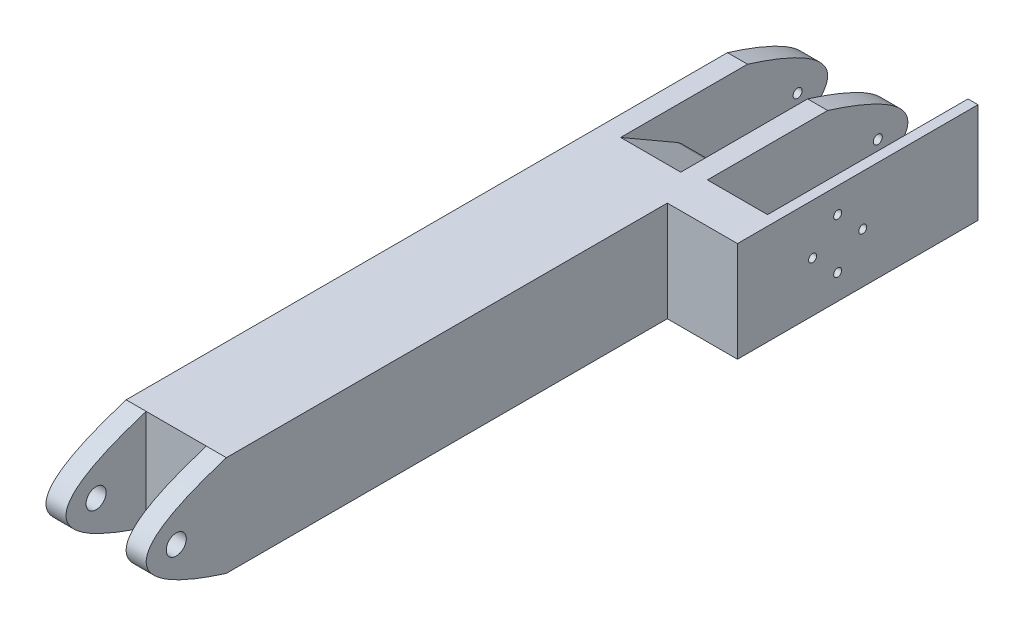
ISO-10303-21;
HEADER;
FILE_DESCRIPTION(('STEP AP214'),'2;1');
FILE_NAME('part.step','',(''),(''),'','','');
FILE_SCHEMA(('AUTOMOTIVE_DESIGN { 1 0 10303 214 1 1 1 1 }'));
ENDSEC;
DATA;
#1=APPLICATION_CONTEXT('core data for automotive mechanical design processes');
#2=APPLICATION_PROTOCOL_DEFINITION('international standard','automotive_design',2000,#1);
#3=PRODUCT_CONTEXT('',#1,'mechanical');
#4=PRODUCT('Part','Part','',(#3));
#5=PRODUCT_RELATED_PRODUCT_CATEGORY('part','',(#4));
#6=PRODUCT_DEFINITION_FORMATION('','',#4);
#7=PRODUCT_DEFINITION_CONTEXT('part definition',#1,'design');
#8=PRODUCT_DEFINITION('design','',#6,#7);
#9=PRODUCT_DEFINITION_SHAPE('','',#8);
#10=(LENGTH_UNIT() NAMED_UNIT(*) SI_UNIT(.MILLI.,.METRE.));
#11=(NAMED_UNIT(*) PLANE_ANGLE_UNIT() SI_UNIT($,.RADIAN.));
#12=(NAMED_UNIT(*) SI_UNIT($,.STERADIAN.) SOLID_ANGLE_UNIT());
#13=UNCERTAINTY_MEASURE_WITH_UNIT(LENGTH_MEASURE(1.E-05),#10,'distance_accuracy_value','');
#14=(GEOMETRIC_REPRESENTATION_CONTEXT(3) GLOBAL_UNCERTAINTY_ASSIGNED_CONTEXT((#13)) GLOBAL_UNIT_ASSIGNED_CONTEXT((#10,
#11,#12)) REPRESENTATION_CONTEXT('',''));
#15=CARTESIAN_POINT('',(0.,0.,0.));
#16=DIRECTION('',(0.,0.,1.));
#17=DIRECTION('',(1.,0.,0.));
#18=AXIS2_PLACEMENT_3D('',#15,#16,#17);
#19=CARTESIAN_POINT('',(50.,17.0460014070586,295.871498940101));
#20=DIRECTION('',(-1.,0.,0.));
#21=DIRECTION('',(0.,0.,1.));
#22=AXIS2_PLACEMENT_3D('',#19,#20,#21);
#23=PLANE('',#22);
#24=CARTESIAN_POINT('',(50.,17.0460014069818,-69.1285010598985));
#25=DIRECTION('',(1.,0.,0.));
#26=DIRECTION('',(0.,0.,-1.));
#27=AXIS2_PLACEMENT_3D('',#24,#25,#26);
#28=CIRCLE('',#27,2.25);
#29=CARTESIAN_POINT('',(50.,17.0460014069818,-71.3785010598985));
#30=VERTEX_POINT('',#29);
#31=EDGE_CURVE('E283',#30,#30,#28,.T.);
#32=ORIENTED_EDGE('',*,*,#31,.F.);
#33=EDGE_LOOP('',(#32));
#34=FACE_BOUND('',#33,.T.);
#35=DIRECTION('',(0.,1.,0.));
#36=VECTOR('',#35,1.);
#37=CARTESIAN_POINT('',(50.,-7.95399859301822,15.8714989401015));
#38=LINE('',#37,#36);
#39=CARTESIAN_POINT('',(50.,-7.95399859301822,15.8714989401015));
#40=VERTEX_POINT('',#39);
#41=CARTESIAN_POINT('',(50.,42.0460014069818,15.8714989401015));
#42=VERTEX_POINT('',#41);
#43=EDGE_CURVE('E460',#40,#42,#38,.T.);
#44=ORIENTED_EDGE('',*,*,#43,.F.);
#45=DIRECTION('',(0.,0.,-1.));
#46=VECTOR('',#45,1.);
#47=CARTESIAN_POINT('',(50.,-7.95399859301822,255.871498940101));
#48=LINE('',#47,#46);
#49=CARTESIAN_POINT('',(50.,-7.95399859301822,-44.1285010598985));
#50=VERTEX_POINT('',#49);
#51=EDGE_CURVE('E198',#40,#50,#48,.T.);
#52=ORIENTED_EDGE('',*,*,#51,.T.);
#53=CARTESIAN_POINT('',(50.,-7.95399859301822,-44.1285010598985));
#54=CARTESIAN_POINT('',(50.,17.0460014069818,-124.128501059899));
#55=CARTESIAN_POINT('',(50.,42.0460014069818,-44.1285010598985));
#56=B_SPLINE_CURVE_WITH_KNOTS('',2,(#53,#54,#55),.UNSPECIFIED.,.F.,.F.,(3,3),(0.,1.),.UNSPECIFIED.);
#57=CARTESIAN_POINT('',(50.,42.0460014069818,-44.1285010598985));
#58=VERTEX_POINT('',#57);
#59=EDGE_CURVE('E197',#50,#58,#56,.T.);
#60=ORIENTED_EDGE('',*,*,#59,.T.);
#61=DIRECTION('',(0.,0.,1.));
#62=VECTOR('',#61,1.);
#63=CARTESIAN_POINT('',(50.,42.0460014069818,255.871498940101));
#64=LINE('',#63,#62);
#65=EDGE_CURVE('E213',#58,#42,#64,.T.);
#66=ORIENTED_EDGE('',*,*,#65,.T.);
#67=EDGE_LOOP('',(#44,#52,#60,#66));
#68=FACE_BOUND('',#67,.T.);
#69=ADVANCED_FACE('F39',(#34,#68),#23,.F.);
#70=CARTESIAN_POINT('',(50.,42.0460014069818,255.871498940101));
#71=DIRECTION('',(0.,-1.,0.));
#72=DIRECTION('',(0.,0.,-1.));
#73=AXIS2_PLACEMENT_3D('',#70,#71,#72);
#74=PLANE('',#73);
#75=DIRECTION('',(0.,0.,1.));
#76=VECTOR('',#75,1.);
#77=CARTESIAN_POINT('',(40.,42.0460014069818,255.871498940101));
#78=LINE('',#77,#76);
#79=CARTESIAN_POINT('',(40.,42.0460014069818,-44.1285010598986));
#80=VERTEX_POINT('',#79);
#81=CARTESIAN_POINT('',(40.,42.0460014069818,19.1727691293236));
#82=VERTEX_POINT('',#81);
#83=EDGE_CURVE('E352',#80,#82,#78,.T.);
#84=ORIENTED_EDGE('',*,*,#83,.T.);
#85=DIRECTION('',(-1.,0.,0.));
#86=VECTOR('',#85,1.);
#87=CARTESIAN_POINT('',(40.,42.0460014069818,19.1727691293236));
#88=LINE('',#87,#86);
#89=CARTESIAN_POINT('',(10.,42.0460014069818,19.1727691293236));
#90=VERTEX_POINT('',#89);
#91=EDGE_CURVE('E399',#82,#90,#88,.T.);
#92=ORIENTED_EDGE('',*,*,#91,.T.);
#93=DIRECTION('',(0.,0.,-1.));
#94=VECTOR('',#93,1.);
#95=CARTESIAN_POINT('',(10.,42.0460014069818,255.871498940101));
#96=LINE('',#95,#94);
#97=CARTESIAN_POINT('',(10.,42.0460014069818,-44.1285010598986));
#98=VERTEX_POINT('',#97);
#99=EDGE_CURVE('E358',#90,#98,#96,.T.);
#100=ORIENTED_EDGE('',*,*,#99,.T.);
#101=DIRECTION('',(-1.,0.,0.));
#102=VECTOR('',#101,1.);
#103=CARTESIAN_POINT('',(50.,42.0460014069818,-44.1285010598985));
#104=LINE('',#103,#102);
#105=CARTESIAN_POINT('',(0.,42.0460014069818,-44.1285010598985));
#106=VERTEX_POINT('',#105);
#107=EDGE_CURVE('E333',#98,#106,#104,.T.);
#108=ORIENTED_EDGE('',*,*,#107,.T.);
#109=DIRECTION('',(0.,0.,1.));
#110=VECTOR('',#109,1.);
#111=CARTESIAN_POINT('',(0.,42.0460014069818,255.871498940101));
#112=LINE('',#111,#110);
#113=CARTESIAN_POINT('',(0.,42.0460014069818,255.871498940101));
#114=VERTEX_POINT('',#113);
#115=EDGE_CURVE('E323',#106,#114,#112,.T.);
#116=ORIENTED_EDGE('',*,*,#115,.T.);
#117=DIRECTION('',(-1.,0.,0.));
#118=VECTOR('',#117,1.);
#119=CARTESIAN_POINT('',(50.,42.0460014069818,255.871498940101));
#120=LINE('',#119,#118);
#121=CARTESIAN_POINT('',(10.,42.0460014069818,255.871498940101));
#122=VERTEX_POINT('',#121);
#123=EDGE_CURVE('E335',#122,#114,#120,.T.);
#124=ORIENTED_EDGE('',*,*,#123,.F.);
#125=CARTESIAN_POINT('',(40.,42.0460014069818,255.871498940101));
#126=VERTEX_POINT('',#125);
#127=EDGE_CURVE('E334',#126,#122,#120,.T.);
#128=ORIENTED_EDGE('',*,*,#127,.F.);
#129=CARTESIAN_POINT('',(50.,42.0460014069818,255.871498940101));
#130=VERTEX_POINT('',#129);
#131=EDGE_CURVE('E330',#130,#126,#120,.T.);
#132=ORIENTED_EDGE('',*,*,#131,.F.);
#133=CARTESIAN_POINT('',(50.,42.0460014069818,35.8714989401015));
#134=VERTEX_POINT('',#133);
#135=EDGE_CURVE('E202',#134,#130,#64,.T.);
#136=ORIENTED_EDGE('',*,*,#135,.F.);
#137=DIRECTION('',(1.,0.,0.));
#138=VECTOR('',#137,1.);
#139=CARTESIAN_POINT('',(50.,42.0460014069818,35.8714989401015));
#140=LINE('',#139,#138);
#141=CARTESIAN_POINT('',(85.,42.0460014069818,35.8714989401015));
#142=VERTEX_POINT('',#141);
#143=EDGE_CURVE('E170',#134,#142,#140,.T.);
#144=ORIENTED_EDGE('',*,*,#143,.T.);
#145=DIRECTION('',(0.,0.,-1.));
#146=VECTOR('',#145,1.);
#147=CARTESIAN_POINT('',(85.,42.0460014069818,35.8714989401015));
#148=LINE('',#147,#146);
#149=CARTESIAN_POINT('',(85.,42.0460014069818,-84.1285010598986));
#150=VERTEX_POINT('',#149);
#151=EDGE_CURVE('E756',#142,#150,#148,.T.);
#152=ORIENTED_EDGE('',*,*,#151,.T.);
#153=DIRECTION('',(-1.,0.,0.));
#154=VECTOR('',#153,1.);
#155=CARTESIAN_POINT('',(85.,42.0460014069818,-84.1285010598986));
#156=LINE('',#155,#154);
#157=CARTESIAN_POINT('',(80.,42.0460014069818,-84.1285010598986));
#158=VERTEX_POINT('',#157);
#159=EDGE_CURVE('E761',#150,#158,#156,.T.);
#160=ORIENTED_EDGE('',*,*,#159,.T.);
#161=DIRECTION('',(0.,0.,1.));
#162=VECTOR('',#161,1.);
#163=CARTESIAN_POINT('',(80.,42.0460014069818,-84.1285010598986));
#164=LINE('',#163,#162);
#165=CARTESIAN_POINT('',(80.,42.0460014069818,15.8714989401015));
#166=VERTEX_POINT('',#165);
#167=EDGE_CURVE('E774',#158,#166,#164,.T.);
#168=ORIENTED_EDGE('',*,*,#167,.T.);
#169=DIRECTION('',(-1.,0.,0.));
#170=VECTOR('',#169,1.);
#171=CARTESIAN_POINT('',(80.,42.0460014069818,15.8714989401015));
#172=LINE('',#171,#170);
#173=EDGE_CURVE('E189',#166,#42,#172,.T.);
#174=ORIENTED_EDGE('',*,*,#173,.T.);
#175=ORIENTED_EDGE('',*,*,#65,.F.);
#176=EDGE_CURVE('E336',#58,#80,#104,.T.);
#177=ORIENTED_EDGE('',*,*,#176,.T.);
#178=EDGE_LOOP('',(#84,#92,#100,#108,#116,#124,#128,#132,#136,#144,#152,#160,#168,#174,#175,#177));
#179=FACE_BOUND('',#178,.T.);
#180=ADVANCED_FACE('F226',(#179),#74,.F.);
#181=CARTESIAN_POINT('',(50.,42.0460014069818,255.871498940101));
#182=CARTESIAN_POINT('',(50.,17.0460014071354,335.871498940102));
#183=CARTESIAN_POINT('',(50.,-7.95399859301822,255.871498940101));
#184=B_SPLINE_CURVE_WITH_KNOTS('',2,(#181,#182,#183),.UNSPECIFIED.,.F.,.F.,(3,3),(0.,1.),.UNSPECIFIED.);
#185=DIRECTION('',(-1.,0.,0.));
#186=VECTOR('',#185,1.);
#187=SURFACE_OF_LINEAR_EXTRUSION('',#184,#186);
#188=DIRECTION('',(-1.,0.,0.));
#189=VECTOR('',#188,1.);
#190=CARTESIAN_POINT('',(50.,-7.95399859301822,255.871498940101));
#191=LINE('',#190,#189);
#192=CARTESIAN_POINT('',(10.,-7.95399859301822,255.871498940101));
#193=VERTEX_POINT('',#192);
#194=CARTESIAN_POINT('',(0.,-7.95399859301822,255.871498940101));
#195=VERTEX_POINT('',#194);
#196=EDGE_CURVE('E345',#193,#195,#191,.T.);
#197=ORIENTED_EDGE('',*,*,#196,.F.);
#198=CARTESIAN_POINT('',(10.,42.0460014069818,255.871498940101));
#199=CARTESIAN_POINT('',(10.,17.0460014071354,335.871498940102));
#200=CARTESIAN_POINT('',(10.,-7.95399859301822,255.871498940101));
#201=B_SPLINE_CURVE_WITH_KNOTS('',2,(#198,#199,#200),.UNSPECIFIED.,.F.,.F.,(3,3),(0.,1.),.UNSPECIFIED.);
#202=EDGE_CURVE('E353',#193,#122,#201,.F.);
#203=ORIENTED_EDGE('',*,*,#202,.T.);
#204=ORIENTED_EDGE('',*,*,#123,.T.);
#205=CARTESIAN_POINT('',(0.,42.0460014069818,255.871498940101));
#206=CARTESIAN_POINT('',(0.,17.0460014071354,335.871498940102));
#207=CARTESIAN_POINT('',(0.,-7.95399859301822,255.871498940101));
#208=B_SPLINE_CURVE_WITH_KNOTS('',2,(#205,#206,#207),.UNSPECIFIED.,.F.,.F.,(3,3),(0.,1.),.UNSPECIFIED.);
#209=EDGE_CURVE('E300',#114,#195,#208,.T.);
#210=ORIENTED_EDGE('',*,*,#209,.T.);
#211=EDGE_LOOP('',(#197,#203,#204,#210));
#212=FACE_BOUND('',#211,.T.);
#213=ADVANCED_FACE('F233',(#212),#187,.F.);
#214=CARTESIAN_POINT('',(50.,17.0460014070886,280.871498940101));
#215=DIRECTION('',(-1.,0.,0.));
#216=DIRECTION('',(0.,0.,1.));
#217=AXIS2_PLACEMENT_3D('',#214,#215,#216);
#218=CYLINDRICAL_SURFACE('',#217,4.99999999999999);
#219=CARTESIAN_POINT('',(10.,17.0460014070886,280.871498940101));
#220=DIRECTION('',(-1.,0.,0.));
#221=DIRECTION('',(0.,0.,1.));
#222=AXIS2_PLACEMENT_3D('',#219,#220,#221);
#223=CIRCLE('',#222,4.99999999999999);
#224=CARTESIAN_POINT('',(10.,17.0460014070886,285.871498940101));
#225=VERTEX_POINT('',#224);
#226=EDGE_CURVE('E366',#225,#225,#223,.T.);
#227=ORIENTED_EDGE('',*,*,#226,.F.);
#228=EDGE_LOOP('',(#227));
#229=FACE_BOUND('',#228,.T.);
#230=CARTESIAN_POINT('',(0.,17.0460014070886,280.871498940101));
#231=DIRECTION('',(1.,0.,0.));
#232=DIRECTION('',(0.,0.,-1.));
#233=AXIS2_PLACEMENT_3D('',#230,#231,#232);
#234=CIRCLE('',#233,4.99999999999999);
#235=CARTESIAN_POINT('',(0.,17.0460014070886,275.871498940101));
#236=VERTEX_POINT('',#235);
#237=EDGE_CURVE('E285',#236,#236,#234,.T.);
#238=ORIENTED_EDGE('',*,*,#237,.F.);
#239=EDGE_LOOP('',(#238));
#240=FACE_BOUND('',#239,.T.);
#241=ADVANCED_FACE('F240',(#229,#240),#218,.F.);
#242=DIRECTION('',(-1.,0.,0.));
#243=VECTOR('',#242,1.);
#244=SURFACE_OF_LINEAR_EXTRUSION('',#56,#243);
#245=ORIENTED_EDGE('',*,*,#107,.F.);
#246=CARTESIAN_POINT('',(10.,-7.95399859301822,-44.1285010598985));
#247=CARTESIAN_POINT('',(10.,17.0460014069818,-124.128501059899));
#248=CARTESIAN_POINT('',(10.,42.0460014069818,-44.1285010598985));
#249=B_SPLINE_CURVE_WITH_KNOTS('',2,(#246,#247,#248),.UNSPECIFIED.,.F.,.F.,(3,3),(0.,1.),.UNSPECIFIED.);
#250=CARTESIAN_POINT('',(10.,-7.95399859301822,-44.1285010598985));
#251=VERTEX_POINT('',#250);
#252=EDGE_CURVE('E440',#98,#251,#249,.F.);
#253=ORIENTED_EDGE('',*,*,#252,.T.);
#254=DIRECTION('',(-1.,0.,0.));
#255=VECTOR('',#254,1.);
#256=CARTESIAN_POINT('',(50.,-7.95399859301822,-44.1285010598985));
#257=LINE('',#256,#255);
#258=CARTESIAN_POINT('',(0.,-7.95399859301822,-44.1285010598985));
#259=VERTEX_POINT('',#258);
#260=EDGE_CURVE('E340',#251,#259,#257,.T.);
#261=ORIENTED_EDGE('',*,*,#260,.T.);
#262=CARTESIAN_POINT('',(0.,-7.95399859301822,-44.1285010598985));
#263=CARTESIAN_POINT('',(0.,17.0460014069818,-124.128501059899));
#264=CARTESIAN_POINT('',(0.,42.0460014069818,-44.1285010598985));
#265=B_SPLINE_CURVE_WITH_KNOTS('',2,(#262,#263,#264),.UNSPECIFIED.,.F.,.F.,(3,3),(0.,1.),.UNSPECIFIED.);
#266=EDGE_CURVE('E310',#259,#106,#265,.T.);
#267=ORIENTED_EDGE('',*,*,#266,.T.);
#268=EDGE_LOOP('',(#245,#253,#261,#267));
#269=FACE_BOUND('',#268,.T.);
#270=ADVANCED_FACE('F225',(#269),#244,.F.);
#271=CARTESIAN_POINT('',(50.,17.0460014069818,-69.1285010598985));
#272=DIRECTION('',(-1.,0.,0.));
#273=DIRECTION('',(0.,0.,1.));
#274=AXIS2_PLACEMENT_3D('',#271,#272,#273);
#275=CYLINDRICAL_SURFACE('',#274,2.25);
#276=CARTESIAN_POINT('',(10.,17.0460014069818,-69.1285010598985));
#277=DIRECTION('',(-1.,0.,0.));
#278=DIRECTION('',(0.,0.,1.));
#279=AXIS2_PLACEMENT_3D('',#276,#277,#278);
#280=CIRCLE('',#279,2.25);
#281=CARTESIAN_POINT('',(10.,17.0460014069818,-66.8785010598985));
#282=VERTEX_POINT('',#281);
#283=EDGE_CURVE('E354',#282,#282,#280,.T.);
#284=ORIENTED_EDGE('',*,*,#283,.F.);
#285=EDGE_LOOP('',(#284));
#286=FACE_BOUND('',#285,.T.);
#287=CARTESIAN_POINT('',(0.,17.0460014069818,-69.1285010598985));
#288=DIRECTION('',(1.,0.,0.));
#289=DIRECTION('',(0.,0.,-1.));
#290=AXIS2_PLACEMENT_3D('',#287,#288,#289);
#291=CIRCLE('',#290,2.25);
#292=CARTESIAN_POINT('',(0.,17.0460014069818,-71.3785010598985));
#293=VERTEX_POINT('',#292);
#294=EDGE_CURVE('E286',#293,#293,#291,.T.);
#295=ORIENTED_EDGE('',*,*,#294,.F.);
#296=EDGE_LOOP('',(#295));
#297=FACE_BOUND('',#296,.T.);
#298=ADVANCED_FACE('F253',(#286,#297),#275,.F.);
#299=CARTESIAN_POINT('',(50.,-7.95399859301822,255.871498940101));
#300=VERTEX_POINT('',#299);
#301=CARTESIAN_POINT('',(50.,-7.95399859301822,35.8714989401015));
#302=VERTEX_POINT('',#301);
#303=EDGE_CURVE('E183',#300,#302,#48,.T.);
#304=ORIENTED_EDGE('',*,*,#303,.T.);
#305=DIRECTION('',(0.,1.,0.));
#306=VECTOR('',#305,1.);
#307=CARTESIAN_POINT('',(50.,-7.95399859301822,35.8714989401015));
#308=LINE('',#307,#306);
#309=EDGE_CURVE('E165',#302,#134,#308,.T.);
#310=ORIENTED_EDGE('',*,*,#309,.T.);
#311=ORIENTED_EDGE('',*,*,#135,.T.);
#312=EDGE_CURVE('E194',#130,#300,#184,.T.);
#313=ORIENTED_EDGE('',*,*,#312,.T.);
#314=EDGE_LOOP('',(#304,#310,#311,#313));
#315=FACE_BOUND('',#314,.T.);
#316=CARTESIAN_POINT('',(50.,17.0460014070886,280.871498940101));
#317=DIRECTION('',(1.,0.,0.));
#318=DIRECTION('',(0.,0.,-1.));
#319=AXIS2_PLACEMENT_3D('',#316,#317,#318);
#320=CIRCLE('',#319,4.99999999999999);
#321=CARTESIAN_POINT('',(50.,17.0460014070886,275.871498940101));
#322=VERTEX_POINT('',#321);
#323=EDGE_CURVE('E291',#322,#322,#320,.T.);
#324=ORIENTED_EDGE('',*,*,#323,.F.);
#325=EDGE_LOOP('',(#324));
#326=FACE_BOUND('',#325,.T.);
#327=ADVANCED_FACE('F191',(#315,#326),#23,.F.);
#328=CARTESIAN_POINT('',(0.,17.0460014070586,295.871498940101));
#329=DIRECTION('',(-1.,0.,0.));
#330=DIRECTION('',(0.,0.,1.));
#331=AXIS2_PLACEMENT_3D('',#328,#329,#330);
#332=PLANE('',#331);
#333=ORIENTED_EDGE('',*,*,#237,.T.);
#334=EDGE_LOOP('',(#333));
#335=FACE_BOUND('',#334,.T.);
#336=ORIENTED_EDGE('',*,*,#209,.F.);
#337=ORIENTED_EDGE('',*,*,#115,.F.);
#338=ORIENTED_EDGE('',*,*,#266,.F.);
#339=DIRECTION('',(0.,0.,-1.));
#340=VECTOR('',#339,1.);
#341=CARTESIAN_POINT('',(0.,-7.95399859301822,255.871498940101));
#342=LINE('',#341,#340);
#343=EDGE_CURVE('E305',#195,#259,#342,.T.);
#344=ORIENTED_EDGE('',*,*,#343,.F.);
#345=EDGE_LOOP('',(#336,#337,#338,#344));
#346=FACE_BOUND('',#345,.T.);
#347=ORIENTED_EDGE('',*,*,#294,.T.);
#348=EDGE_LOOP('',(#347));
#349=FACE_BOUND('',#348,.T.);
#350=ADVANCED_FACE('F231',(#335,#346,#349),#332,.T.);
#351=ORIENTED_EDGE('',*,*,#131,.T.);
#352=CARTESIAN_POINT('',(40.,42.0460014069818,255.871498940101));
#353=CARTESIAN_POINT('',(40.,17.0460014071354,335.871498940102));
#354=CARTESIAN_POINT('',(40.,-7.95399859301822,255.871498940101));
#355=B_SPLINE_CURVE_WITH_KNOTS('',2,(#352,#353,#354),.UNSPECIFIED.,.F.,.F.,(3,3),(0.,1.),.UNSPECIFIED.);
#356=CARTESIAN_POINT('',(40.,-7.95399859301822,255.871498940101));
#357=VERTEX_POINT('',#356);
#358=EDGE_CURVE('E364',#126,#357,#355,.T.);
#359=ORIENTED_EDGE('',*,*,#358,.T.);
#360=EDGE_CURVE('E346',#300,#357,#191,.T.);
#361=ORIENTED_EDGE('',*,*,#360,.F.);
#362=ORIENTED_EDGE('',*,*,#312,.F.);
#363=EDGE_LOOP('',(#351,#359,#361,#362));
#364=FACE_BOUND('',#363,.T.);
#365=ADVANCED_FACE('F229',(#364),#187,.F.);
#366=CARTESIAN_POINT('',(50.,-7.95399859301822,255.871498940101));
#367=DIRECTION('',(0.,1.,0.));
#368=DIRECTION('',(0.,0.,1.));
#369=AXIS2_PLACEMENT_3D('',#366,#367,#368);
#370=PLANE('',#369);
#371=DIRECTION('',(-1.,0.,0.));
#372=VECTOR('',#371,1.);
#373=CARTESIAN_POINT('',(40.,-7.95399859301822,19.1727691293229));
#374=LINE('',#373,#372);
#375=CARTESIAN_POINT('',(40.,-7.95399859301822,19.1727691293229));
#376=VERTEX_POINT('',#375);
#377=CARTESIAN_POINT('',(10.,-7.95399859301822,19.1727691293229));
#378=VERTEX_POINT('',#377);
#379=EDGE_CURVE('E452',#376,#378,#374,.T.);
#380=ORIENTED_EDGE('',*,*,#379,.F.);
#381=DIRECTION('',(0.,0.,-1.));
#382=VECTOR('',#381,1.);
#383=CARTESIAN_POINT('',(40.,-7.95399859301822,255.871498940101));
#384=LINE('',#383,#382);
#385=CARTESIAN_POINT('',(40.,-7.95399859301822,-44.1285010598985));
#386=VERTEX_POINT('',#385);
#387=EDGE_CURVE('E359',#376,#386,#384,.T.);
#388=ORIENTED_EDGE('',*,*,#387,.T.);
#389=EDGE_CURVE('E341',#50,#386,#257,.T.);
#390=ORIENTED_EDGE('',*,*,#389,.F.);
#391=ORIENTED_EDGE('',*,*,#51,.F.);
#392=DIRECTION('',(-1.,0.,0.));
#393=VECTOR('',#392,1.);
#394=CARTESIAN_POINT('',(80.,-7.95399859301822,15.8714989401015));
#395=LINE('',#394,#393);
#396=CARTESIAN_POINT('',(80.,-7.95399859301822,15.8714989401015));
#397=VERTEX_POINT('',#396);
#398=EDGE_CURVE('E176',#397,#40,#395,.T.);
#399=ORIENTED_EDGE('',*,*,#398,.F.);
#400=DIRECTION('',(0.,0.,1.));
#401=VECTOR('',#400,1.);
#402=CARTESIAN_POINT('',(80.,-7.95399859301822,-84.1285010598986));
#403=LINE('',#402,#401);
#404=CARTESIAN_POINT('',(80.,-7.95399859301822,-84.1285010598986));
#405=VERTEX_POINT('',#404);
#406=EDGE_CURVE('E791',#405,#397,#403,.T.);
#407=ORIENTED_EDGE('',*,*,#406,.F.);
#408=DIRECTION('',(-1.,0.,0.));
#409=VECTOR('',#408,1.);
#410=CARTESIAN_POINT('',(85.,-7.95399859301822,-84.1285010598986));
#411=LINE('',#410,#409);
#412=CARTESIAN_POINT('',(85.,-7.95399859301822,-84.1285010598986));
#413=VERTEX_POINT('',#412);
#414=EDGE_CURVE('E794',#413,#405,#411,.T.);
#415=ORIENTED_EDGE('',*,*,#414,.F.);
#416=DIRECTION('',(0.,0.,-1.));
#417=VECTOR('',#416,1.);
#418=CARTESIAN_POINT('',(85.,-7.95399859301822,35.8714989401015));
#419=LINE('',#418,#417);
#420=CARTESIAN_POINT('',(85.,-7.95399859301822,35.8714989401015));
#421=VERTEX_POINT('',#420);
#422=EDGE_CURVE('E187',#421,#413,#419,.T.);
#423=ORIENTED_EDGE('',*,*,#422,.F.);
#424=DIRECTION('',(1.,0.,0.));
#425=VECTOR('',#424,1.);
#426=CARTESIAN_POINT('',(50.,-7.95399859301822,35.8714989401015));
#427=LINE('',#426,#425);
#428=EDGE_CURVE('E168',#302,#421,#427,.T.);
#429=ORIENTED_EDGE('',*,*,#428,.F.);
#430=ORIENTED_EDGE('',*,*,#303,.F.);
#431=ORIENTED_EDGE('',*,*,#360,.T.);
#432=DIRECTION('',(1.,0.,0.));
#433=VECTOR('',#432,1.);
#434=CARTESIAN_POINT('',(10.,-7.95399859301822,255.871498940101));
#435=LINE('',#434,#433);
#436=EDGE_CURVE('E393',#193,#357,#435,.T.);
#437=ORIENTED_EDGE('',*,*,#436,.F.);
#438=ORIENTED_EDGE('',*,*,#196,.T.);
#439=ORIENTED_EDGE('',*,*,#343,.T.);
#440=ORIENTED_EDGE('',*,*,#260,.F.);
#441=DIRECTION('',(0.,0.,1.));
#442=VECTOR('',#441,1.);
#443=CARTESIAN_POINT('',(10.,-7.95399859301822,255.871498940101));
#444=LINE('',#443,#442);
#445=EDGE_CURVE('E293',#251,#378,#444,.T.);
#446=ORIENTED_EDGE('',*,*,#445,.T.);
#447=EDGE_LOOP('',(#380,#388,#390,#391,#399,#407,#415,#423,#429,#430,#431,#437,#438,#439,#440,#446));
#448=FACE_BOUND('',#447,.T.);
#449=ADVANCED_FACE('F181',(#448),#370,.F.);
#450=ORIENTED_EDGE('',*,*,#389,.T.);
#451=CARTESIAN_POINT('',(40.,-7.95399859301822,-44.1285010598985));
#452=CARTESIAN_POINT('',(40.,17.0460014069818,-124.128501059899));
#453=CARTESIAN_POINT('',(40.,42.0460014069818,-44.1285010598985));
#454=B_SPLINE_CURVE_WITH_KNOTS('',2,(#451,#452,#453),.UNSPECIFIED.,.F.,.F.,(3,3),(0.,1.),.UNSPECIFIED.);
#455=EDGE_CURVE('E427',#386,#80,#454,.T.);
#456=ORIENTED_EDGE('',*,*,#455,.T.);
#457=ORIENTED_EDGE('',*,*,#176,.F.);
#458=ORIENTED_EDGE('',*,*,#59,.F.);
#459=EDGE_LOOP('',(#450,#456,#457,#458));
#460=FACE_BOUND('',#459,.T.);
#461=ADVANCED_FACE('F219',(#460),#244,.F.);
#462=CARTESIAN_POINT('',(40.,17.0460014070886,280.871498940101));
#463=DIRECTION('',(1.,0.,0.));
#464=DIRECTION('',(0.,0.,-1.));
#465=AXIS2_PLACEMENT_3D('',#462,#463,#464);
#466=CIRCLE('',#465,4.99999999999999);
#467=CARTESIAN_POINT('',(40.,17.0460014070886,275.871498940101));
#468=VERTEX_POINT('',#467);
#469=EDGE_CURVE('E360',#468,#468,#466,.T.);
#470=ORIENTED_EDGE('',*,*,#469,.F.);
#471=EDGE_LOOP('',(#470));
#472=FACE_BOUND('',#471,.T.);
#473=ORIENTED_EDGE('',*,*,#323,.T.);
#474=EDGE_LOOP('',(#473));
#475=FACE_BOUND('',#474,.T.);
#476=ADVANCED_FACE('F223',(#472,#475),#218,.F.);
#477=CARTESIAN_POINT('',(40.,17.0460014069818,-69.1285010598985));
#478=DIRECTION('',(1.,0.,0.));
#479=DIRECTION('',(0.,0.,-1.));
#480=AXIS2_PLACEMENT_3D('',#477,#478,#479);
#481=CIRCLE('',#480,2.25);
#482=CARTESIAN_POINT('',(40.,17.0460014069818,-71.3785010598985));
#483=VERTEX_POINT('',#482);
#484=EDGE_CURVE('E281',#483,#483,#481,.T.);
#485=ORIENTED_EDGE('',*,*,#484,.F.);
#486=EDGE_LOOP('',(#485));
#487=FACE_BOUND('',#486,.T.);
#488=ORIENTED_EDGE('',*,*,#31,.T.);
#489=EDGE_LOOP('',(#488));
#490=FACE_BOUND('',#489,.T.);
#491=ADVANCED_FACE('F259',(#487,#490),#275,.F.);
#492=CARTESIAN_POINT('',(10.,-35.,-84.1285010598986));
#493=DIRECTION('',(-1.,0.,0.));
#494=DIRECTION('',(0.,0.,1.));
#495=AXIS2_PLACEMENT_3D('',#492,#493,#494);
#496=PLANE('',#495);
#497=ORIENTED_EDGE('',*,*,#283,.T.);
#498=EDGE_LOOP('',(#497));
#499=FACE_BOUND('',#498,.T.);
#500=ORIENTED_EDGE('',*,*,#252,.F.);
#501=ORIENTED_EDGE('',*,*,#99,.F.);
#502=DIRECTION('',(0.,0.499999999999998,0.86602540378444));
#503=VECTOR('',#502,1.);
#504=CARTESIAN_POINT('',(10.,17.0460014069818,-24.1285010598986));
#505=LINE('',#504,#503);
#506=CARTESIAN_POINT('',(10.,25.7062554448261,-9.12850105989858));
#507=VERTEX_POINT('',#506);
#508=EDGE_CURVE('E457',#507,#90,#505,.T.);
#509=ORIENTED_EDGE('',*,*,#508,.F.);
#510=CARTESIAN_POINT('',(10.,17.0460014069817,-4.1285010598986));
#511=DIRECTION('',(-1.,0.,0.));
#512=DIRECTION('',(0.,0.,1.));
#513=AXIS2_PLACEMENT_3D('',#510,#511,#512);
#514=CIRCLE('',#513,10.);
#515=CARTESIAN_POINT('',(10.,8.38574736913734,-9.12850105989864));
#516=VERTEX_POINT('',#515);
#517=EDGE_CURVE('E48',#507,#516,#514,.T.);
#518=ORIENTED_EDGE('',*,*,#517,.T.);
#519=DIRECTION('',(0.,0.500000000000004,-0.866025403784436));
#520=VECTOR('',#519,1.);
#521=CARTESIAN_POINT('',(10.,17.0460014069818,-24.1285010598986));
#522=LINE('',#521,#520);
#523=EDGE_CURVE('E454',#378,#516,#522,.T.);
#524=ORIENTED_EDGE('',*,*,#523,.F.);
#525=ORIENTED_EDGE('',*,*,#445,.F.);
#526=EDGE_LOOP('',(#500,#501,#509,#518,#524,#525));
#527=FACE_BOUND('',#526,.T.);
#528=ADVANCED_FACE('F268',(#499,#527),#496,.F.);
#529=CARTESIAN_POINT('',(40.,-35.,-84.1285010598986));
#530=DIRECTION('',(1.,0.,0.));
#531=DIRECTION('',(0.,0.,-1.));
#532=AXIS2_PLACEMENT_3D('',#529,#530,#531);
#533=PLANE('',#532);
#534=ORIENTED_EDGE('',*,*,#484,.T.);
#535=EDGE_LOOP('',(#534));
#536=FACE_BOUND('',#535,.T.);
#537=ORIENTED_EDGE('',*,*,#387,.F.);
#538=DIRECTION('',(0.,0.500000000000004,-0.866025403784436));
#539=VECTOR('',#538,1.);
#540=CARTESIAN_POINT('',(40.,17.0460014069818,-24.1285010598986));
#541=LINE('',#540,#539);
#542=CARTESIAN_POINT('',(40.,8.38574736913734,-9.12850105989864));
#543=VERTEX_POINT('',#542);
#544=EDGE_CURVE('E455',#376,#543,#541,.T.);
#545=ORIENTED_EDGE('',*,*,#544,.T.);
#546=CARTESIAN_POINT('',(40.,17.0460014069817,-4.1285010598986));
#547=DIRECTION('',(1.,0.,0.));
#548=DIRECTION('',(0.,0.,-1.));
#549=AXIS2_PLACEMENT_3D('',#546,#547,#548);
#550=CIRCLE('',#549,10.);
#551=CARTESIAN_POINT('',(40.,25.7062554448261,-9.12850105989858));
#552=VERTEX_POINT('',#551);
#553=EDGE_CURVE('E11',#543,#552,#550,.T.);
#554=ORIENTED_EDGE('',*,*,#553,.T.);
#555=DIRECTION('',(0.,0.499999999999998,0.86602540378444));
#556=VECTOR('',#555,1.);
#557=CARTESIAN_POINT('',(40.,17.0460014069818,-24.1285010598986));
#558=LINE('',#557,#556);
#559=EDGE_CURVE('E405',#552,#82,#558,.T.);
#560=ORIENTED_EDGE('',*,*,#559,.T.);
#561=ORIENTED_EDGE('',*,*,#83,.F.);
#562=ORIENTED_EDGE('',*,*,#455,.F.);
#563=EDGE_LOOP('',(#537,#545,#554,#560,#561,#562));
#564=FACE_BOUND('',#563,.T.);
#565=ADVANCED_FACE('F275',(#536,#564),#533,.F.);
#566=CARTESIAN_POINT('',(10.,44.0460014069818,255.871498940101));
#567=DIRECTION('',(0.,0.,-1.));
#568=DIRECTION('',(-1.,0.,0.));
#569=AXIS2_PLACEMENT_3D('',#566,#567,#568);
#570=PLANE('',#569);
#571=DIRECTION('',(0.,-1.,0.));
#572=VECTOR('',#571,1.);
#573=CARTESIAN_POINT('',(10.,44.0460014069818,255.871498940101));
#574=LINE('',#573,#572);
#575=EDGE_CURVE('E398',#122,#193,#574,.T.);
#576=ORIENTED_EDGE('',*,*,#575,.T.);
#577=ORIENTED_EDGE('',*,*,#436,.T.);
#578=DIRECTION('',(0.,-1.,0.));
#579=VECTOR('',#578,1.);
#580=CARTESIAN_POINT('',(40.,44.0460014069818,255.871498940101));
#581=LINE('',#580,#579);
#582=EDGE_CURVE('E365',#126,#357,#581,.T.);
#583=ORIENTED_EDGE('',*,*,#582,.F.);
#584=ORIENTED_EDGE('',*,*,#127,.T.);
#585=EDGE_LOOP('',(#576,#577,#583,#584));
#586=FACE_BOUND('',#585,.T.);
#587=ADVANCED_FACE('F533',(#586),#570,.F.);
#588=CARTESIAN_POINT('',(10.,44.0460014069818,295.871498940101));
#589=DIRECTION('',(-1.,0.,0.));
#590=DIRECTION('',(0.,0.,1.));
#591=AXIS2_PLACEMENT_3D('',#588,#589,#590);
#592=PLANE('',#591);
#593=ORIENTED_EDGE('',*,*,#226,.T.);
#594=EDGE_LOOP('',(#593));
#595=FACE_BOUND('',#594,.T.);
#596=ORIENTED_EDGE('',*,*,#575,.F.);
#597=ORIENTED_EDGE('',*,*,#202,.F.);
#598=EDGE_LOOP('',(#596,#597));
#599=FACE_BOUND('',#598,.T.);
#600=ADVANCED_FACE('F531',(#595,#599),#592,.F.);
#601=CARTESIAN_POINT('',(40.,44.0460014069818,295.871498940101));
#602=DIRECTION('',(1.,0.,0.));
#603=DIRECTION('',(0.,0.,-1.));
#604=AXIS2_PLACEMENT_3D('',#601,#602,#603);
#605=PLANE('',#604);
#606=ORIENTED_EDGE('',*,*,#469,.T.);
#607=EDGE_LOOP('',(#606));
#608=FACE_BOUND('',#607,.T.);
#609=ORIENTED_EDGE('',*,*,#582,.T.);
#610=ORIENTED_EDGE('',*,*,#358,.F.);
#611=EDGE_LOOP('',(#609,#610));
#612=FACE_BOUND('',#611,.T.);
#613=ADVANCED_FACE('F528',(#608,#612),#605,.F.);
#614=CARTESIAN_POINT('',(40.,17.0460014069818,-24.1285010598986));
#615=DIRECTION('',(0.,-0.86602540378444,0.499999999999998));
#616=DIRECTION('',(0.,-0.499999999999998,-0.86602540378444));
#617=AXIS2_PLACEMENT_3D('',#614,#615,#616);
#618=PLANE('',#617);
#619=ORIENTED_EDGE('',*,*,#559,.F.);
#620=DIRECTION('',(-1.,0.,0.));
#621=VECTOR('',#620,1.);
#622=CARTESIAN_POINT('',(40.,25.7062554448261,-9.12850105989857));
#623=LINE('',#622,#621);
#624=EDGE_CURVE('E349',#552,#507,#623,.T.);
#625=ORIENTED_EDGE('',*,*,#624,.T.);
#626=ORIENTED_EDGE('',*,*,#508,.T.);
#627=ORIENTED_EDGE('',*,*,#91,.F.);
#628=EDGE_LOOP('',(#619,#625,#626,#627));
#629=FACE_BOUND('',#628,.T.);
#630=ADVANCED_FACE('F474',(#629),#618,.F.);
#631=CARTESIAN_POINT('',(40.,17.0460014069818,-24.1285010598986));
#632=DIRECTION('',(0.,0.866025403784436,0.500000000000004));
#633=DIRECTION('',(0.,-0.500000000000004,0.866025403784436));
#634=AXIS2_PLACEMENT_3D('',#631,#632,#633);
#635=PLANE('',#634);
#636=ORIENTED_EDGE('',*,*,#523,.T.);
#637=DIRECTION('',(-1.,0.,0.));
#638=VECTOR('',#637,1.);
#639=CARTESIAN_POINT('',(40.,8.38574736913734,-9.12850105989864));
#640=LINE('',#639,#638);
#641=EDGE_CURVE('E55',#516,#543,#640,.F.);
#642=ORIENTED_EDGE('',*,*,#641,.T.);
#643=ORIENTED_EDGE('',*,*,#544,.F.);
#644=ORIENTED_EDGE('',*,*,#379,.T.);
#645=EDGE_LOOP('',(#636,#642,#643,#644));
#646=FACE_BOUND('',#645,.T.);
#647=ADVANCED_FACE('F453',(#646),#635,.F.);
#648=CARTESIAN_POINT('',(80.,-7.95399859301822,15.8714989401015));
#649=DIRECTION('',(0.,0.,-1.));
#650=DIRECTION('',(-1.,0.,0.));
#651=AXIS2_PLACEMENT_3D('',#648,#649,#650);
#652=PLANE('',#651);
#653=ORIENTED_EDGE('',*,*,#173,.F.);
#654=DIRECTION('',(0.,1.,0.));
#655=VECTOR('',#654,1.);
#656=CARTESIAN_POINT('',(80.,-7.95399859301822,15.8714989401015));
#657=LINE('',#656,#655);
#658=EDGE_CURVE('E465',#397,#166,#657,.T.);
#659=ORIENTED_EDGE('',*,*,#658,.F.);
#660=ORIENTED_EDGE('',*,*,#398,.T.);
#661=ORIENTED_EDGE('',*,*,#43,.T.);
#662=EDGE_LOOP('',(#653,#659,#660,#661));
#663=FACE_BOUND('',#662,.T.);
#664=ADVANCED_FACE('F506',(#663),#652,.T.);
#665=CARTESIAN_POINT('',(80.,-7.95399859301822,-84.1285010598986));
#666=DIRECTION('',(-1.,0.,0.));
#667=DIRECTION('',(0.,0.,1.));
#668=AXIS2_PLACEMENT_3D('',#665,#666,#667);
#669=PLANE('',#668);
#670=CARTESIAN_POINT('',(80.,29.5460014069818,-14.1285010598985));
#671=DIRECTION('',(-1.,0.,0.));
#672=DIRECTION('',(0.,0.,1.));
#673=AXIS2_PLACEMENT_3D('',#670,#671,#672);
#674=CIRCLE('',#673,2.);
#675=CARTESIAN_POINT('',(80.,29.5460014069818,-12.1285010598985));
#676=VERTEX_POINT('',#675);
#677=EDGE_CURVE('E764',#676,#676,#674,.T.);
#678=ORIENTED_EDGE('',*,*,#677,.F.);
#679=EDGE_LOOP('',(#678));
#680=FACE_BOUND('',#679,.T.);
#681=CARTESIAN_POINT('',(80.,17.0460014069818,-26.6285010598985));
#682=DIRECTION('',(-1.,0.,0.));
#683=DIRECTION('',(0.,0.,1.));
#684=AXIS2_PLACEMENT_3D('',#681,#682,#683);
#685=CIRCLE('',#684,2.);
#686=CARTESIAN_POINT('',(80.,17.0460014069818,-24.6285010598985));
#687=VERTEX_POINT('',#686);
#688=EDGE_CURVE('E767',#687,#687,#685,.T.);
#689=ORIENTED_EDGE('',*,*,#688,.F.);
#690=EDGE_LOOP('',(#689));
#691=FACE_BOUND('',#690,.T.);
#692=CARTESIAN_POINT('',(80.,4.54600140698178,-14.1285010598985));
#693=DIRECTION('',(-1.,0.,0.));
#694=DIRECTION('',(0.,0.,1.));
#695=AXIS2_PLACEMENT_3D('',#692,#693,#694);
#696=CIRCLE('',#695,2.);
#697=CARTESIAN_POINT('',(80.,4.54600140698178,-12.1285010598985));
#698=VERTEX_POINT('',#697);
#699=EDGE_CURVE('E803',#698,#698,#696,.T.);
#700=ORIENTED_EDGE('',*,*,#699,.F.);
#701=EDGE_LOOP('',(#700));
#702=FACE_BOUND('',#701,.T.);
#703=CARTESIAN_POINT('',(80.,17.0460014069818,-1.62850105989853));
#704=DIRECTION('',(-1.,0.,0.));
#705=DIRECTION('',(0.,0.,1.));
#706=AXIS2_PLACEMENT_3D('',#703,#704,#705);
#707=CIRCLE('',#706,2.);
#708=CARTESIAN_POINT('',(80.,17.0460014069818,0.371498940101465));
#709=VERTEX_POINT('',#708);
#710=EDGE_CURVE('E807',#709,#709,#707,.T.);
#711=ORIENTED_EDGE('',*,*,#710,.F.);
#712=EDGE_LOOP('',(#711));
#713=FACE_BOUND('',#712,.T.);
#714=ORIENTED_EDGE('',*,*,#167,.F.);
#715=DIRECTION('',(0.,1.,0.));
#716=VECTOR('',#715,1.);
#717=CARTESIAN_POINT('',(80.,-7.95399859301822,-84.1285010598986));
#718=LINE('',#717,#716);
#719=EDGE_CURVE('E783',#405,#158,#718,.T.);
#720=ORIENTED_EDGE('',*,*,#719,.F.);
#721=ORIENTED_EDGE('',*,*,#406,.T.);
#722=ORIENTED_EDGE('',*,*,#658,.T.);
#723=EDGE_LOOP('',(#714,#720,#721,#722));
#724=FACE_BOUND('',#723,.T.);
#725=ADVANCED_FACE('F509',(#680,#691,#702,#713,#724),#669,.T.);
#726=CARTESIAN_POINT('',(85.,-7.95399859301822,-84.1285010598986));
#727=DIRECTION('',(0.,0.,-1.));
#728=DIRECTION('',(-1.,0.,0.));
#729=AXIS2_PLACEMENT_3D('',#726,#727,#728);
#730=PLANE('',#729);
#731=ORIENTED_EDGE('',*,*,#159,.F.);
#732=DIRECTION('',(0.,1.,0.));
#733=VECTOR('',#732,1.);
#734=CARTESIAN_POINT('',(85.,-7.95399859301822,-84.1285010598986));
#735=LINE('',#734,#733);
#736=EDGE_CURVE('E757',#413,#150,#735,.T.);
#737=ORIENTED_EDGE('',*,*,#736,.F.);
#738=ORIENTED_EDGE('',*,*,#414,.T.);
#739=ORIENTED_EDGE('',*,*,#719,.T.);
#740=EDGE_LOOP('',(#731,#737,#738,#739));
#741=FACE_BOUND('',#740,.T.);
#742=ADVANCED_FACE('F513',(#741),#730,.T.);
#743=CARTESIAN_POINT('',(85.,-7.95399859301822,35.8714989401015));
#744=DIRECTION('',(1.,0.,0.));
#745=DIRECTION('',(0.,0.,-1.));
#746=AXIS2_PLACEMENT_3D('',#743,#744,#745);
#747=PLANE('',#746);
#748=CARTESIAN_POINT('',(85.,29.5460014069818,-14.1285010598985));
#749=DIRECTION('',(1.,0.,0.));
#750=DIRECTION('',(0.,0.,-1.));
#751=AXIS2_PLACEMENT_3D('',#748,#749,#750);
#752=CIRCLE('',#751,2.);
#753=CARTESIAN_POINT('',(85.,29.5460014069818,-16.1285010598985));
#754=VERTEX_POINT('',#753);
#755=EDGE_CURVE('E741',#754,#754,#752,.T.);
#756=ORIENTED_EDGE('',*,*,#755,.F.);
#757=EDGE_LOOP('',(#756));
#758=FACE_BOUND('',#757,.T.);
#759=CARTESIAN_POINT('',(85.,17.0460014069818,-26.6285010598985));
#760=DIRECTION('',(1.,0.,0.));
#761=DIRECTION('',(0.,0.,-1.));
#762=AXIS2_PLACEMENT_3D('',#759,#760,#761);
#763=CIRCLE('',#762,2.);
#764=CARTESIAN_POINT('',(85.,17.0460014069818,-28.6285010598985));
#765=VERTEX_POINT('',#764);
#766=EDGE_CURVE('E745',#765,#765,#763,.T.);
#767=ORIENTED_EDGE('',*,*,#766,.F.);
#768=EDGE_LOOP('',(#767));
#769=FACE_BOUND('',#768,.T.);
#770=CARTESIAN_POINT('',(85.,4.54600140698178,-14.1285010598985));
#771=DIRECTION('',(1.,0.,0.));
#772=DIRECTION('',(0.,0.,-1.));
#773=AXIS2_PLACEMENT_3D('',#770,#771,#772);
#774=CIRCLE('',#773,2.);
#775=CARTESIAN_POINT('',(85.,4.54600140698178,-16.1285010598985));
#776=VERTEX_POINT('',#775);
#777=EDGE_CURVE('E749',#776,#776,#774,.T.);
#778=ORIENTED_EDGE('',*,*,#777,.F.);
#779=EDGE_LOOP('',(#778));
#780=FACE_BOUND('',#779,.T.);
#781=CARTESIAN_POINT('',(85.,17.0460014069818,-1.62850105989853));
#782=DIRECTION('',(1.,0.,0.));
#783=DIRECTION('',(0.,0.,-1.));
#784=AXIS2_PLACEMENT_3D('',#781,#782,#783);
#785=CIRCLE('',#784,2.);
#786=CARTESIAN_POINT('',(85.,17.0460014069818,-3.62850105989853));
#787=VERTEX_POINT('',#786);
#788=EDGE_CURVE('E753',#787,#787,#785,.T.);
#789=ORIENTED_EDGE('',*,*,#788,.F.);
#790=EDGE_LOOP('',(#789));
#791=FACE_BOUND('',#790,.T.);
#792=ORIENTED_EDGE('',*,*,#151,.F.);
#793=DIRECTION('',(0.,1.,0.));
#794=VECTOR('',#793,1.);
#795=CARTESIAN_POINT('',(85.,-7.95399859301822,35.8714989401015));
#796=LINE('',#795,#794);
#797=EDGE_CURVE('E175',#421,#142,#796,.T.);
#798=ORIENTED_EDGE('',*,*,#797,.F.);
#799=ORIENTED_EDGE('',*,*,#422,.T.);
#800=ORIENTED_EDGE('',*,*,#736,.T.);
#801=EDGE_LOOP('',(#792,#798,#799,#800));
#802=FACE_BOUND('',#801,.T.);
#803=ADVANCED_FACE('F517',(#758,#769,#780,#791,#802),#747,.T.);
#804=CARTESIAN_POINT('',(50.,-7.95399859301822,35.8714989401015));
#805=DIRECTION('',(0.,0.,1.));
#806=DIRECTION('',(1.,0.,0.));
#807=AXIS2_PLACEMENT_3D('',#804,#805,#806);
#808=PLANE('',#807);
#809=ORIENTED_EDGE('',*,*,#143,.F.);
#810=ORIENTED_EDGE('',*,*,#309,.F.);
#811=ORIENTED_EDGE('',*,*,#428,.T.);
#812=ORIENTED_EDGE('',*,*,#797,.T.);
#813=EDGE_LOOP('',(#809,#810,#811,#812));
#814=FACE_BOUND('',#813,.T.);
#815=ADVANCED_FACE('F167',(#814),#808,.T.);
#816=CARTESIAN_POINT('',(75.,17.0460014069818,-1.62850105989853));
#817=DIRECTION('',(1.,0.,0.));
#818=DIRECTION('',(0.,0.,-1.));
#819=AXIS2_PLACEMENT_3D('',#816,#817,#818);
#820=CYLINDRICAL_SURFACE('',#819,2.);
#821=ORIENTED_EDGE('',*,*,#710,.T.);
#822=EDGE_LOOP('',(#821));
#823=FACE_BOUND('',#822,.T.);
#824=ORIENTED_EDGE('',*,*,#788,.T.);
#825=EDGE_LOOP('',(#824));
#826=FACE_BOUND('',#825,.T.);
#827=ADVANCED_FACE('F501',(#823,#826),#820,.F.);
#828=CARTESIAN_POINT('',(75.,4.54600140698178,-14.1285010598985));
#829=DIRECTION('',(1.,0.,0.));
#830=DIRECTION('',(0.,0.,-1.));
#831=AXIS2_PLACEMENT_3D('',#828,#829,#830);
#832=CYLINDRICAL_SURFACE('',#831,2.);
#833=ORIENTED_EDGE('',*,*,#699,.T.);
#834=EDGE_LOOP('',(#833));
#835=FACE_BOUND('',#834,.T.);
#836=ORIENTED_EDGE('',*,*,#777,.T.);
#837=EDGE_LOOP('',(#836));
#838=FACE_BOUND('',#837,.T.);
#839=ADVANCED_FACE('F493',(#835,#838),#832,.F.);
#840=CARTESIAN_POINT('',(75.,17.0460014069818,-26.6285010598985));
#841=DIRECTION('',(1.,0.,0.));
#842=DIRECTION('',(0.,0.,-1.));
#843=AXIS2_PLACEMENT_3D('',#840,#841,#842);
#844=CYLINDRICAL_SURFACE('',#843,2.);
#845=ORIENTED_EDGE('',*,*,#688,.T.);
#846=EDGE_LOOP('',(#845));
#847=FACE_BOUND('',#846,.T.);
#848=ORIENTED_EDGE('',*,*,#766,.T.);
#849=EDGE_LOOP('',(#848));
#850=FACE_BOUND('',#849,.T.);
#851=ADVANCED_FACE('F487',(#847,#850),#844,.F.);
#852=CARTESIAN_POINT('',(75.,29.5460014069818,-14.1285010598985));
#853=DIRECTION('',(1.,0.,0.));
#854=DIRECTION('',(0.,0.,-1.));
#855=AXIS2_PLACEMENT_3D('',#852,#853,#854);
#856=CYLINDRICAL_SURFACE('',#855,2.);
#857=ORIENTED_EDGE('',*,*,#677,.T.);
#858=EDGE_LOOP('',(#857));
#859=FACE_BOUND('',#858,.T.);
#860=ORIENTED_EDGE('',*,*,#755,.T.);
#861=EDGE_LOOP('',(#860));
#862=FACE_BOUND('',#861,.T.);
#863=ADVANCED_FACE('F483',(#859,#862),#856,.F.);
#864=CARTESIAN_POINT('',(40.,17.0460014069817,-4.1285010598986));
#865=DIRECTION('',(-1.,0.,0.));
#866=DIRECTION('',(0.,0.,1.));
#867=AXIS2_PLACEMENT_3D('',#864,#865,#866);
#868=CYLINDRICAL_SURFACE('',#867,10.);
#869=ORIENTED_EDGE('',*,*,#553,.F.);
#870=ORIENTED_EDGE('',*,*,#641,.F.);
#871=ORIENTED_EDGE('',*,*,#517,.F.);
#872=ORIENTED_EDGE('',*,*,#624,.F.);
#873=EDGE_LOOP('',(#869,#870,#871,#872));
#874=FACE_BOUND('',#873,.T.);
#875=ADVANCED_FACE('F41',(#874),#868,.T.);
#876=CLOSED_SHELL('',(#69,#180,#213,#241,#270,#298,#327,#350,#365,#449,#461,#476,#491,#528,#565,
#587,#600,#613,#630,#647,#664,#725,#742,#803,#815,#827,#839,#851,#863,#875));
#877=MANIFOLD_SOLID_BREP('B2',#876);
#878=ADVANCED_BREP_SHAPE_REPRESENTATION('',(#18,#877),#14);
#879=SHAPE_DEFINITION_REPRESENTATION(#9,#878);
ENDSEC;
END-ISO-10303-21;
